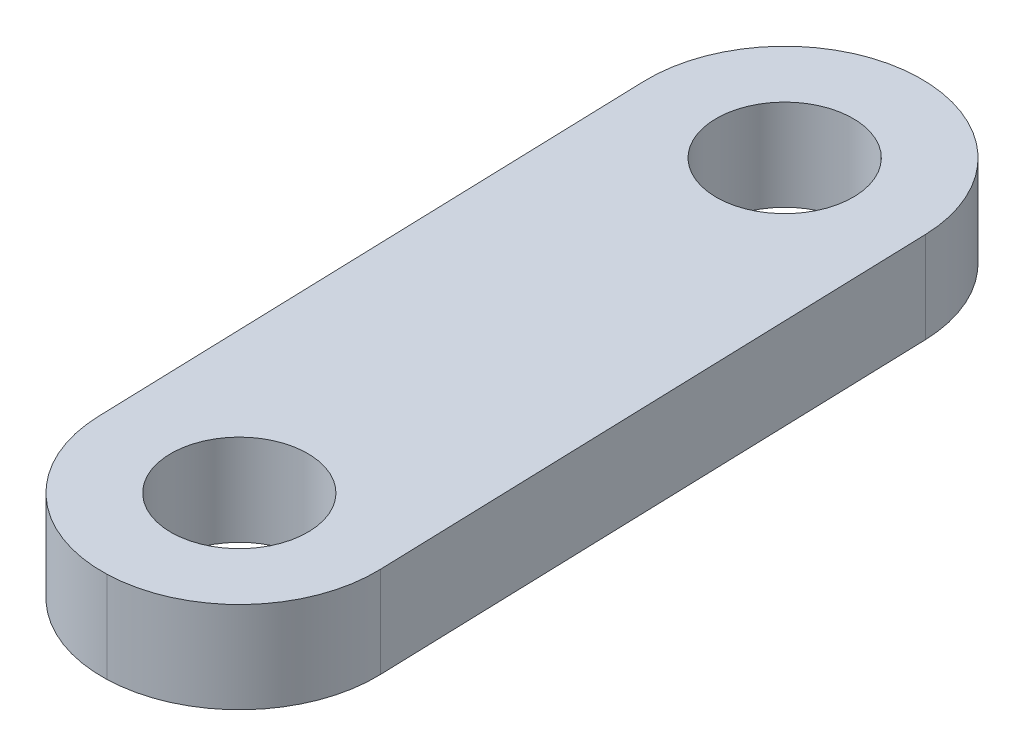
ISO-10303-21;
HEADER;
FILE_DESCRIPTION(('STEP AP214'),'2;1');
FILE_NAME('part.step','',(''),(''),'','','');
FILE_SCHEMA(('AUTOMOTIVE_DESIGN { 1 0 10303 214 1 1 1 1 }'));
ENDSEC;
DATA;
#1=APPLICATION_CONTEXT('core data for automotive mechanical design processes');
#2=APPLICATION_PROTOCOL_DEFINITION('international standard','automotive_design',2000,#1);
#3=PRODUCT_CONTEXT('',#1,'mechanical');
#4=PRODUCT('Part','Part','',(#3));
#5=PRODUCT_RELATED_PRODUCT_CATEGORY('part','',(#4));
#6=PRODUCT_DEFINITION_FORMATION('','',#4);
#7=PRODUCT_DEFINITION_CONTEXT('part definition',#1,'design');
#8=PRODUCT_DEFINITION('design','',#6,#7);
#9=PRODUCT_DEFINITION_SHAPE('','',#8);
#10=(LENGTH_UNIT() NAMED_UNIT(*) SI_UNIT(.MILLI.,.METRE.));
#11=(NAMED_UNIT(*) PLANE_ANGLE_UNIT() SI_UNIT($,.RADIAN.));
#12=(NAMED_UNIT(*) SI_UNIT($,.STERADIAN.) SOLID_ANGLE_UNIT());
#13=UNCERTAINTY_MEASURE_WITH_UNIT(LENGTH_MEASURE(1.E-05),#10,'distance_accuracy_value','');
#14=(GEOMETRIC_REPRESENTATION_CONTEXT(3) GLOBAL_UNCERTAINTY_ASSIGNED_CONTEXT((#13)) GLOBAL_UNIT_ASSIGNED_CONTEXT((#10,
#11,#12)) REPRESENTATION_CONTEXT('',''));
#15=CARTESIAN_POINT('',(0.,0.,0.));
#16=DIRECTION('',(0.,0.,1.));
#17=DIRECTION('',(1.,0.,0.));
#18=AXIS2_PLACEMENT_3D('',#15,#16,#17);
#19=CARTESIAN_POINT('',(0.,6.35,0.));
#20=DIRECTION('',(0.,-1.,0.));
#21=DIRECTION('',(0.,0.,-1.));
#22=AXIS2_PLACEMENT_3D('',#19,#20,#21);
#23=PLANE('',#22);
#24=DIRECTION('',(0.999519320555898,0.,-0.0310020617939448));
#25=VECTOR('',#24,1.);
#26=CARTESIAN_POINT('',(156.894212304701,6.35,71.0146933234929));
#27=LINE('',#26,#25);
#28=CARTESIAN_POINT('',(166.414633832996,6.35,70.7193986849056));
#29=VERTEX_POINT('',#28);
#30=CARTESIAN_POINT('',(166.423790776406,6.35,70.7191146642572));
#31=VERTEX_POINT('',#30);
#32=EDGE_CURVE('E177',#29,#31,#27,.T.);
#33=ORIENTED_EDGE('',*,*,#32,.T.);
#34=CARTESIAN_POINT('',(166.128496137819,6.35,61.1986931359623));
#35=DIRECTION('',(0.,-1.,0.));
#36=DIRECTION('',(0.,0.,-1.));
#37=AXIS2_PLACEMENT_3D('',#34,#35,#36);
#38=CIRCLE('',#37,9.525);
#39=CARTESIAN_POINT('',(175.648917666114,6.35,60.903398497375));
#40=VERTEX_POINT('',#39);
#41=EDGE_CURVE('E154',#31,#40,#38,.F.);
#42=ORIENTED_EDGE('',*,*,#41,.T.);
#43=DIRECTION('',(-0.0310020617939451,0.,-0.999519320555898));
#44=VECTOR('',#43,1.);
#45=CARTESIAN_POINT('',(174.137406496537,6.35,12.1716519680953));
#46=LINE('',#45,#44);
#47=CARTESIAN_POINT('',(174.432701135125,6.35,21.6920734963902));
#48=VERTEX_POINT('',#47);
#49=EDGE_CURVE('E125',#40,#48,#46,.T.);
#50=ORIENTED_EDGE('',*,*,#49,.T.);
#51=CARTESIAN_POINT('',(164.91227960683,6.35,21.9873681349775));
#52=DIRECTION('',(0.,-1.,0.));
#53=DIRECTION('',(0.,0.,-1.));
#54=AXIS2_PLACEMENT_3D('',#51,#52,#53);
#55=CIRCLE('',#54,9.525);
#56=CARTESIAN_POINT('',(164.616984968242,6.35,12.4669466066826));
#57=VERTEX_POINT('',#56);
#58=EDGE_CURVE('E149',#48,#57,#55,.F.);
#59=ORIENTED_EDGE('',*,*,#58,.T.);
#60=DIRECTION('',(-0.999519320555898,0.,0.0310020617939459));
#61=VECTOR('',#60,1.);
#62=CARTESIAN_POINT('',(155.087406496537,6.35,12.7625252659183));
#63=LINE('',#62,#61);
#64=CARTESIAN_POINT('',(164.607828024832,6.35,12.4672306273309));
#65=VERTEX_POINT('',#64);
#66=EDGE_CURVE('E132',#57,#65,#63,.T.);
#67=ORIENTED_EDGE('',*,*,#66,.T.);
#68=CARTESIAN_POINT('',(164.903122663419,6.35,21.9876521556259));
#69=DIRECTION('',(0.,-1.,0.));
#70=DIRECTION('',(0.,0.,-1.));
#71=AXIS2_PLACEMENT_3D('',#68,#69,#70);
#72=CIRCLE('',#71,9.525);
#73=CARTESIAN_POINT('',(155.382701135125,6.35,22.2829467942132));
#74=VERTEX_POINT('',#73);
#75=EDGE_CURVE('E61',#65,#74,#72,.F.);
#76=ORIENTED_EDGE('',*,*,#75,.T.);
#77=DIRECTION('',(0.0310020617939451,0.,0.999519320555898));
#78=VECTOR('',#77,1.);
#79=CARTESIAN_POINT('',(155.087406496537,6.35,12.7625252659183));
#80=LINE('',#79,#78);
#81=CARTESIAN_POINT('',(156.598917666114,6.35,61.494271795198));
#82=VERTEX_POINT('',#81);
#83=EDGE_CURVE('E135',#74,#82,#80,.T.);
#84=ORIENTED_EDGE('',*,*,#83,.T.);
#85=CARTESIAN_POINT('',(166.119339194408,6.35,61.1989771566106));
#86=DIRECTION('',(0.,-1.,0.));
#87=DIRECTION('',(0.,0.,-1.));
#88=AXIS2_PLACEMENT_3D('',#85,#86,#87);
#89=CIRCLE('',#88,9.525);
#90=EDGE_CURVE('E152',#82,#29,#89,.F.);
#91=ORIENTED_EDGE('',*,*,#90,.T.);
#92=EDGE_LOOP('',(#33,#42,#50,#59,#67,#76,#84,#91));
#93=FACE_BOUND('',#92,.T.);
#94=CARTESIAN_POINT('',(164.907701135125,6.35,21.9875101453017));
#95=DIRECTION('',(0.,1.,0.));
#96=DIRECTION('',(0.,0.,1.));
#97=AXIS2_PLACEMENT_3D('',#94,#95,#96);
#98=CIRCLE('',#97,4.76250000000001);
#99=CARTESIAN_POINT('',(164.907701135125,6.35,26.7500101453017));
#100=VERTEX_POINT('',#99);
#101=EDGE_CURVE('E170',#100,#100,#98,.T.);
#102=ORIENTED_EDGE('',*,*,#101,.F.);
#103=EDGE_LOOP('',(#102));
#104=FACE_BOUND('',#103,.T.);
#105=CARTESIAN_POINT('',(166.123917666114,6.35,61.1988351462865));
#106=DIRECTION('',(0.,1.,0.));
#107=DIRECTION('',(0.,0.,1.));
#108=AXIS2_PLACEMENT_3D('',#105,#106,#107);
#109=CIRCLE('',#108,4.76250000000001);
#110=CARTESIAN_POINT('',(166.123917666114,6.35,65.9613351462865));
#111=VERTEX_POINT('',#110);
#112=EDGE_CURVE('E182',#111,#111,#109,.T.);
#113=ORIENTED_EDGE('',*,*,#112,.F.);
#114=EDGE_LOOP('',(#113));
#115=FACE_BOUND('',#114,.T.);
#116=ADVANCED_FACE('F39',(#93,#104,#115),#23,.F.);
#117=CARTESIAN_POINT('',(0.,0.,0.));
#118=DIRECTION('',(0.,-1.,0.));
#119=DIRECTION('',(0.,0.,-1.));
#120=AXIS2_PLACEMENT_3D('',#117,#118,#119);
#121=PLANE('',#120);
#122=CARTESIAN_POINT('',(164.907701135125,0.,21.9875101453017));
#123=DIRECTION('',(0.,1.,0.));
#124=DIRECTION('',(0.,0.,1.));
#125=AXIS2_PLACEMENT_3D('',#122,#123,#124);
#126=CIRCLE('',#125,4.76250000000001);
#127=CARTESIAN_POINT('',(164.907701135125,0.,26.7500101453017));
#128=VERTEX_POINT('',#127);
#129=EDGE_CURVE('E173',#128,#128,#126,.T.);
#130=ORIENTED_EDGE('',*,*,#129,.T.);
#131=EDGE_LOOP('',(#130));
#132=FACE_BOUND('',#131,.T.);
#133=DIRECTION('',(-0.0310020617939451,0.,-0.999519320555898));
#134=VECTOR('',#133,1.);
#135=CARTESIAN_POINT('',(174.137406496537,0.,12.1716519680953));
#136=LINE('',#135,#134);
#137=CARTESIAN_POINT('',(175.648917666114,0.,60.903398497375));
#138=VERTEX_POINT('',#137);
#139=CARTESIAN_POINT('',(174.432701135125,0.,21.6920734963902));
#140=VERTEX_POINT('',#139);
#141=EDGE_CURVE('E122',#138,#140,#136,.T.);
#142=ORIENTED_EDGE('',*,*,#141,.F.);
#143=CARTESIAN_POINT('',(166.128496137819,0.,61.1986931359623));
#144=DIRECTION('',(0.,-1.,0.));
#145=DIRECTION('',(0.,0.,-1.));
#146=AXIS2_PLACEMENT_3D('',#143,#144,#145);
#147=CIRCLE('',#146,9.525);
#148=CARTESIAN_POINT('',(166.423790776406,0.,70.7191146642572));
#149=VERTEX_POINT('',#148);
#150=EDGE_CURVE('E105',#138,#149,#147,.T.);
#151=ORIENTED_EDGE('',*,*,#150,.T.);
#152=DIRECTION('',(0.999519320555898,0.,-0.0310020617939448));
#153=VECTOR('',#152,1.);
#154=CARTESIAN_POINT('',(156.894212304701,0.,71.0146933234929));
#155=LINE('',#154,#153);
#156=CARTESIAN_POINT('',(166.414633832996,0.,70.7193986849056));
#157=VERTEX_POINT('',#156);
#158=EDGE_CURVE('E133',#157,#149,#155,.T.);
#159=ORIENTED_EDGE('',*,*,#158,.F.);
#160=CARTESIAN_POINT('',(166.119339194408,0.,61.1989771566106));
#161=DIRECTION('',(0.,-1.,0.));
#162=DIRECTION('',(0.,0.,-1.));
#163=AXIS2_PLACEMENT_3D('',#160,#161,#162);
#164=CIRCLE('',#163,9.525);
#165=CARTESIAN_POINT('',(156.598917666114,0.,61.494271795198));
#166=VERTEX_POINT('',#165);
#167=EDGE_CURVE('E116',#157,#166,#164,.T.);
#168=ORIENTED_EDGE('',*,*,#167,.T.);
#169=DIRECTION('',(0.0310020617939451,0.,0.999519320555898));
#170=VECTOR('',#169,1.);
#171=CARTESIAN_POINT('',(155.087406496537,0.,12.7625252659183));
#172=LINE('',#171,#170);
#173=CARTESIAN_POINT('',(155.382701135125,0.,22.2829467942132));
#174=VERTEX_POINT('',#173);
#175=EDGE_CURVE('E137',#174,#166,#172,.T.);
#176=ORIENTED_EDGE('',*,*,#175,.F.);
#177=CARTESIAN_POINT('',(164.903122663419,0.,21.9876521556259));
#178=DIRECTION('',(0.,-1.,0.));
#179=DIRECTION('',(0.,0.,-1.));
#180=AXIS2_PLACEMENT_3D('',#177,#178,#179);
#181=CIRCLE('',#180,9.525);
#182=CARTESIAN_POINT('',(164.607828024832,0.,12.4672306273309));
#183=VERTEX_POINT('',#182);
#184=EDGE_CURVE('E143',#174,#183,#181,.T.);
#185=ORIENTED_EDGE('',*,*,#184,.T.);
#186=DIRECTION('',(-0.999519320555898,0.,0.0310020617939459));
#187=VECTOR('',#186,1.);
#188=CARTESIAN_POINT('',(155.087406496537,0.,12.7625252659183));
#189=LINE('',#188,#187);
#190=CARTESIAN_POINT('',(164.616984968242,0.,12.4669466066826));
#191=VERTEX_POINT('',#190);
#192=EDGE_CURVE('E165',#191,#183,#189,.T.);
#193=ORIENTED_EDGE('',*,*,#192,.F.);
#194=CARTESIAN_POINT('',(164.91227960683,0.,21.9873681349775));
#195=DIRECTION('',(0.,-1.,0.));
#196=DIRECTION('',(0.,0.,-1.));
#197=AXIS2_PLACEMENT_3D('',#194,#195,#196);
#198=CIRCLE('',#197,9.525);
#199=EDGE_CURVE('E126',#191,#140,#198,.T.);
#200=ORIENTED_EDGE('',*,*,#199,.T.);
#201=EDGE_LOOP('',(#142,#151,#159,#168,#176,#185,#193,#200));
#202=FACE_BOUND('',#201,.T.);
#203=CARTESIAN_POINT('',(166.123917666114,0.,61.1988351462865));
#204=DIRECTION('',(0.,1.,0.));
#205=DIRECTION('',(0.,0.,1.));
#206=AXIS2_PLACEMENT_3D('',#203,#204,#205);
#207=CIRCLE('',#206,4.76250000000001);
#208=CARTESIAN_POINT('',(166.123917666114,0.,65.9613351462865));
#209=VERTEX_POINT('',#208);
#210=EDGE_CURVE('E184',#209,#209,#207,.T.);
#211=ORIENTED_EDGE('',*,*,#210,.T.);
#212=EDGE_LOOP('',(#211));
#213=FACE_BOUND('',#212,.T.);
#214=ADVANCED_FACE('F129',(#132,#202,#213),#121,.T.);
#215=CARTESIAN_POINT('',(155.087406496537,6.35,12.7625252659183));
#216=DIRECTION('',(0.0310020617939459,0.,0.999519320555898));
#217=DIRECTION('',(0.999519320555898,0.,-0.0310020617939459));
#218=AXIS2_PLACEMENT_3D('',#215,#216,#217);
#219=PLANE('',#218);
#220=ORIENTED_EDGE('',*,*,#192,.T.);
#221=DIRECTION('',(0.,-1.,0.));
#222=VECTOR('',#221,1.);
#223=CARTESIAN_POINT('',(164.607828024832,6.35,12.4672306273309));
#224=LINE('',#223,#222);
#225=EDGE_CURVE('E11',#183,#65,#224,.F.);
#226=ORIENTED_EDGE('',*,*,#225,.T.);
#227=ORIENTED_EDGE('',*,*,#66,.F.);
#228=DIRECTION('',(0.,-1.,0.));
#229=VECTOR('',#228,1.);
#230=CARTESIAN_POINT('',(164.616984968242,6.35,12.4669466066826));
#231=LINE('',#230,#229);
#232=EDGE_CURVE('E47',#57,#191,#231,.T.);
#233=ORIENTED_EDGE('',*,*,#232,.T.);
#234=EDGE_LOOP('',(#220,#226,#227,#233));
#235=FACE_BOUND('',#234,.T.);
#236=ADVANCED_FACE('F164',(#235),#219,.F.);
#237=CARTESIAN_POINT('',(155.087406496537,6.35,12.7625252659183));
#238=DIRECTION('',(0.999519320555898,0.,-0.0310020617939451));
#239=DIRECTION('',(-0.0310020617939451,0.,-0.999519320555898));
#240=AXIS2_PLACEMENT_3D('',#237,#238,#239);
#241=PLANE('',#240);
#242=ORIENTED_EDGE('',*,*,#175,.T.);
#243=DIRECTION('',(0.,-1.,0.));
#244=VECTOR('',#243,1.);
#245=CARTESIAN_POINT('',(156.598917666114,6.35,61.494271795198));
#246=LINE('',#245,#244);
#247=EDGE_CURVE('E54',#166,#82,#246,.F.);
#248=ORIENTED_EDGE('',*,*,#247,.T.);
#249=ORIENTED_EDGE('',*,*,#83,.F.);
#250=DIRECTION('',(0.,-1.,0.));
#251=VECTOR('',#250,1.);
#252=CARTESIAN_POINT('',(155.382701135125,6.35,22.2829467942132));
#253=LINE('',#252,#251);
#254=EDGE_CURVE('E156',#74,#174,#253,.T.);
#255=ORIENTED_EDGE('',*,*,#254,.T.);
#256=EDGE_LOOP('',(#242,#248,#249,#255));
#257=FACE_BOUND('',#256,.T.);
#258=ADVANCED_FACE('F211',(#257),#241,.F.);
#259=CARTESIAN_POINT('',(156.894212304701,6.35,71.0146933234929));
#260=DIRECTION('',(-0.0310020617939448,0.,-0.999519320555898));
#261=DIRECTION('',(-0.999519320555898,0.,0.0310020617939448));
#262=AXIS2_PLACEMENT_3D('',#259,#260,#261);
#263=PLANE('',#262);
#264=ORIENTED_EDGE('',*,*,#158,.T.);
#265=DIRECTION('',(0.,-1.,0.));
#266=VECTOR('',#265,1.);
#267=CARTESIAN_POINT('',(166.423790776406,6.35,70.7191146642572));
#268=LINE('',#267,#266);
#269=EDGE_CURVE('E110',#149,#31,#268,.F.);
#270=ORIENTED_EDGE('',*,*,#269,.T.);
#271=ORIENTED_EDGE('',*,*,#32,.F.);
#272=DIRECTION('',(0.,-1.,0.));
#273=VECTOR('',#272,1.);
#274=CARTESIAN_POINT('',(166.414633832996,6.35,70.7193986849056));
#275=LINE('',#274,#273);
#276=EDGE_CURVE('E115',#29,#157,#275,.T.);
#277=ORIENTED_EDGE('',*,*,#276,.T.);
#278=EDGE_LOOP('',(#264,#270,#271,#277));
#279=FACE_BOUND('',#278,.T.);
#280=ADVANCED_FACE('F208',(#279),#263,.F.);
#281=CARTESIAN_POINT('',(174.137406496537,6.35,12.1716519680953));
#282=DIRECTION('',(-0.999519320555898,0.,0.0310020617939451));
#283=DIRECTION('',(0.0310020617939451,0.,0.999519320555898));
#284=AXIS2_PLACEMENT_3D('',#281,#282,#283);
#285=PLANE('',#284);
#286=ORIENTED_EDGE('',*,*,#49,.F.);
#287=DIRECTION('',(0.,-1.,0.));
#288=VECTOR('',#287,1.);
#289=CARTESIAN_POINT('',(175.648917666114,6.35,60.903398497375));
#290=LINE('',#289,#288);
#291=EDGE_CURVE('E109',#40,#138,#290,.T.);
#292=ORIENTED_EDGE('',*,*,#291,.T.);
#293=ORIENTED_EDGE('',*,*,#141,.T.);
#294=DIRECTION('',(0.,-1.,0.));
#295=VECTOR('',#294,1.);
#296=CARTESIAN_POINT('',(174.432701135125,6.35,21.6920734963902));
#297=LINE('',#296,#295);
#298=EDGE_CURVE('E127',#140,#48,#297,.F.);
#299=ORIENTED_EDGE('',*,*,#298,.T.);
#300=EDGE_LOOP('',(#286,#292,#293,#299));
#301=FACE_BOUND('',#300,.T.);
#302=ADVANCED_FACE('F121',(#301),#285,.F.);
#303=CARTESIAN_POINT('',(164.907701135125,6.35,21.9875101453017));
#304=DIRECTION('',(0.,-1.,0.));
#305=DIRECTION('',(0.,0.,-1.));
#306=AXIS2_PLACEMENT_3D('',#303,#304,#305);
#307=CYLINDRICAL_SURFACE('',#306,4.76250000000001);
#308=ORIENTED_EDGE('',*,*,#101,.T.);
#309=EDGE_LOOP('',(#308));
#310=FACE_BOUND('',#309,.T.);
#311=ORIENTED_EDGE('',*,*,#129,.F.);
#312=EDGE_LOOP('',(#311));
#313=FACE_BOUND('',#312,.T.);
#314=ADVANCED_FACE('F203',(#310,#313),#307,.F.);
#315=CARTESIAN_POINT('',(166.123917666114,6.35,61.1988351462865));
#316=DIRECTION('',(0.,-1.,0.));
#317=DIRECTION('',(0.,0.,-1.));
#318=AXIS2_PLACEMENT_3D('',#315,#316,#317);
#319=CYLINDRICAL_SURFACE('',#318,4.76250000000001);
#320=ORIENTED_EDGE('',*,*,#112,.T.);
#321=EDGE_LOOP('',(#320));
#322=FACE_BOUND('',#321,.T.);
#323=ORIENTED_EDGE('',*,*,#210,.F.);
#324=EDGE_LOOP('',(#323));
#325=FACE_BOUND('',#324,.T.);
#326=ADVANCED_FACE('F190',(#322,#325),#319,.F.);
#327=CARTESIAN_POINT('',(166.128496137819,6.35,61.1986931359623));
#328=DIRECTION('',(0.,-1.,0.));
#329=DIRECTION('',(0.,0.,-1.));
#330=AXIS2_PLACEMENT_3D('',#327,#328,#329);
#331=CYLINDRICAL_SURFACE('',#330,9.525);
#332=ORIENTED_EDGE('',*,*,#41,.F.);
#333=ORIENTED_EDGE('',*,*,#269,.F.);
#334=ORIENTED_EDGE('',*,*,#150,.F.);
#335=ORIENTED_EDGE('',*,*,#291,.F.);
#336=EDGE_LOOP('',(#332,#333,#334,#335));
#337=FACE_BOUND('',#336,.T.);
#338=ADVANCED_FACE('F108',(#337),#331,.T.);
#339=CARTESIAN_POINT('',(166.119339194408,6.35,61.1989771566106));
#340=DIRECTION('',(0.,-1.,0.));
#341=DIRECTION('',(0.,0.,-1.));
#342=AXIS2_PLACEMENT_3D('',#339,#340,#341);
#343=CYLINDRICAL_SURFACE('',#342,9.525);
#344=ORIENTED_EDGE('',*,*,#90,.F.);
#345=ORIENTED_EDGE('',*,*,#247,.F.);
#346=ORIENTED_EDGE('',*,*,#167,.F.);
#347=ORIENTED_EDGE('',*,*,#276,.F.);
#348=EDGE_LOOP('',(#344,#345,#346,#347));
#349=FACE_BOUND('',#348,.T.);
#350=ADVANCED_FACE('F219',(#349),#343,.T.);
#351=CARTESIAN_POINT('',(164.903122663419,6.35,21.9876521556259));
#352=DIRECTION('',(0.,-1.,0.));
#353=DIRECTION('',(0.,0.,-1.));
#354=AXIS2_PLACEMENT_3D('',#351,#352,#353);
#355=CYLINDRICAL_SURFACE('',#354,9.525);
#356=ORIENTED_EDGE('',*,*,#75,.F.);
#357=ORIENTED_EDGE('',*,*,#225,.F.);
#358=ORIENTED_EDGE('',*,*,#184,.F.);
#359=ORIENTED_EDGE('',*,*,#254,.F.);
#360=EDGE_LOOP('',(#356,#357,#358,#359));
#361=FACE_BOUND('',#360,.T.);
#362=ADVANCED_FACE('F221',(#361),#355,.T.);
#363=CARTESIAN_POINT('',(164.91227960683,6.35,21.9873681349775));
#364=DIRECTION('',(0.,-1.,0.));
#365=DIRECTION('',(0.,0.,-1.));
#366=AXIS2_PLACEMENT_3D('',#363,#364,#365);
#367=CYLINDRICAL_SURFACE('',#366,9.525);
#368=ORIENTED_EDGE('',*,*,#58,.F.);
#369=ORIENTED_EDGE('',*,*,#298,.F.);
#370=ORIENTED_EDGE('',*,*,#199,.F.);
#371=ORIENTED_EDGE('',*,*,#232,.F.);
#372=EDGE_LOOP('',(#368,#369,#370,#371));
#373=FACE_BOUND('',#372,.T.);
#374=ADVANCED_FACE('F41',(#373),#367,.T.);
#375=CLOSED_SHELL('',(#116,#214,#236,#258,#280,#302,#314,#326,#338,#350,#362,#374));
#376=MANIFOLD_SOLID_BREP('B2',#375);
#377=ADVANCED_BREP_SHAPE_REPRESENTATION('',(#18,#376),#14);
#378=SHAPE_DEFINITION_REPRESENTATION(#9,#377);
ENDSEC;
END-ISO-10303-21;
